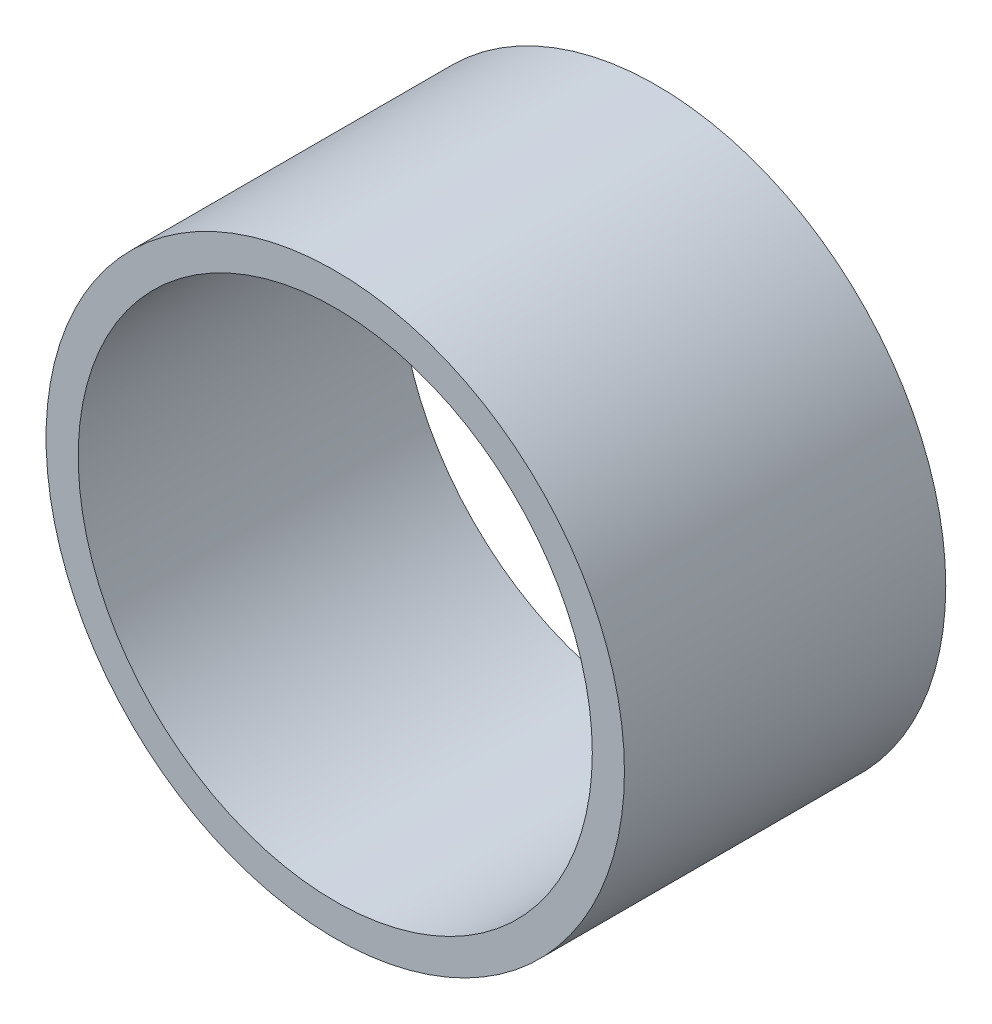
ISO-10303-21;
HEADER;
FILE_DESCRIPTION(('STEP AP214'),'2;1');
FILE_NAME('part.step','',(''),(''),'','','');
FILE_SCHEMA(('AUTOMOTIVE_DESIGN { 1 0 10303 214 1 1 1 1 }'));
ENDSEC;
DATA;
#1=APPLICATION_CONTEXT('core data for automotive mechanical design processes');
#2=APPLICATION_PROTOCOL_DEFINITION('international standard','automotive_design',2000,#1);
#3=PRODUCT_CONTEXT('',#1,'mechanical');
#4=PRODUCT('Part','Part','',(#3));
#5=PRODUCT_RELATED_PRODUCT_CATEGORY('part','',(#4));
#6=PRODUCT_DEFINITION_FORMATION('','',#4);
#7=PRODUCT_DEFINITION_CONTEXT('part definition',#1,'design');
#8=PRODUCT_DEFINITION('design','',#6,#7);
#9=PRODUCT_DEFINITION_SHAPE('','',#8);
#10=(LENGTH_UNIT() NAMED_UNIT(*) SI_UNIT(.MILLI.,.METRE.));
#11=(NAMED_UNIT(*) PLANE_ANGLE_UNIT() SI_UNIT($,.RADIAN.));
#12=(NAMED_UNIT(*) SI_UNIT($,.STERADIAN.) SOLID_ANGLE_UNIT());
#13=UNCERTAINTY_MEASURE_WITH_UNIT(LENGTH_MEASURE(1.E-05),#10,'distance_accuracy_value','');
#14=(GEOMETRIC_REPRESENTATION_CONTEXT(3) GLOBAL_UNCERTAINTY_ASSIGNED_CONTEXT((#13)) GLOBAL_UNIT_ASSIGNED_CONTEXT((#10,
#11,#12)) REPRESENTATION_CONTEXT('',''));
#15=CARTESIAN_POINT('',(0.,0.,0.));
#16=DIRECTION('',(0.,0.,1.));
#17=DIRECTION('',(1.,0.,0.));
#18=AXIS2_PLACEMENT_3D('',#15,#16,#17);
#19=CARTESIAN_POINT('',(0.,0.,5.));
#20=DIRECTION('',(0.,0.,1.));
#21=DIRECTION('',(1.,0.,0.));
#22=AXIS2_PLACEMENT_3D('',#19,#20,#21);
#23=PLANE('',#22);
#24=CARTESIAN_POINT('',(0.,0.,5.));
#25=DIRECTION('',(0.,0.,1.));
#26=DIRECTION('',(1.,0.,0.));
#27=AXIS2_PLACEMENT_3D('',#24,#25,#26);
#28=CIRCLE('',#27,4.5);
#29=CARTESIAN_POINT('',(4.5,0.,5.));
#30=VERTEX_POINT('',#29);
#31=EDGE_CURVE('E10',#30,#30,#28,.T.);
#32=ORIENTED_EDGE('',*,*,#31,.T.);
#33=EDGE_LOOP('',(#32));
#34=FACE_BOUND('',#33,.T.);
#35=CARTESIAN_POINT('',(0.,0.,5.));
#36=DIRECTION('',(0.,0.,1.));
#37=DIRECTION('',(1.,0.,0.));
#38=AXIS2_PLACEMENT_3D('',#35,#36,#37);
#39=CIRCLE('',#38,4.);
#40=CARTESIAN_POINT('',(4.,0.,5.));
#41=VERTEX_POINT('',#40);
#42=EDGE_CURVE('E52',#41,#41,#39,.T.);
#43=ORIENTED_EDGE('',*,*,#42,.F.);
#44=EDGE_LOOP('',(#43));
#45=FACE_BOUND('',#44,.T.);
#46=ADVANCED_FACE('F36',(#34,#45),#23,.T.);
#47=CARTESIAN_POINT('',(0.,0.,0.));
#48=DIRECTION('',(0.,0.,1.));
#49=DIRECTION('',(1.,0.,0.));
#50=AXIS2_PLACEMENT_3D('',#47,#48,#49);
#51=PLANE('',#50);
#52=CARTESIAN_POINT('',(0.,0.,0.));
#53=DIRECTION('',(0.,0.,1.));
#54=DIRECTION('',(1.,0.,0.));
#55=AXIS2_PLACEMENT_3D('',#52,#53,#54);
#56=CIRCLE('',#55,4.5);
#57=CARTESIAN_POINT('',(4.5,0.,0.));
#58=VERTEX_POINT('',#57);
#59=EDGE_CURVE('E40',#58,#58,#56,.T.);
#60=ORIENTED_EDGE('',*,*,#59,.F.);
#61=EDGE_LOOP('',(#60));
#62=FACE_BOUND('',#61,.T.);
#63=CARTESIAN_POINT('',(0.,0.,0.));
#64=DIRECTION('',(0.,0.,1.));
#65=DIRECTION('',(1.,0.,0.));
#66=AXIS2_PLACEMENT_3D('',#63,#64,#65);
#67=CIRCLE('',#66,4.);
#68=CARTESIAN_POINT('',(4.,0.,0.));
#69=VERTEX_POINT('',#68);
#70=EDGE_CURVE('E54',#69,#69,#67,.T.);
#71=ORIENTED_EDGE('',*,*,#70,.T.);
#72=EDGE_LOOP('',(#71));
#73=FACE_BOUND('',#72,.T.);
#74=ADVANCED_FACE('F65',(#62,#73),#51,.F.);
#75=CARTESIAN_POINT('',(0.,0.,5.));
#76=DIRECTION('',(0.,0.,-1.));
#77=DIRECTION('',(-1.,0.,0.));
#78=AXIS2_PLACEMENT_3D('',#75,#76,#77);
#79=CYLINDRICAL_SURFACE('',#78,4.5);
#80=ORIENTED_EDGE('',*,*,#31,.F.);
#81=EDGE_LOOP('',(#80));
#82=FACE_BOUND('',#81,.T.);
#83=ORIENTED_EDGE('',*,*,#59,.T.);
#84=EDGE_LOOP('',(#83));
#85=FACE_BOUND('',#84,.T.);
#86=ADVANCED_FACE('F38',(#82,#85),#79,.T.);
#87=CARTESIAN_POINT('',(0.,0.,5.));
#88=DIRECTION('',(0.,0.,-1.));
#89=DIRECTION('',(-1.,0.,0.));
#90=AXIS2_PLACEMENT_3D('',#87,#88,#89);
#91=CYLINDRICAL_SURFACE('',#90,4.);
#92=ORIENTED_EDGE('',*,*,#42,.T.);
#93=EDGE_LOOP('',(#92));
#94=FACE_BOUND('',#93,.T.);
#95=ORIENTED_EDGE('',*,*,#70,.F.);
#96=EDGE_LOOP('',(#95));
#97=FACE_BOUND('',#96,.T.);
#98=ADVANCED_FACE('F61',(#94,#97),#91,.F.);
#99=CLOSED_SHELL('',(#46,#74,#86,#98));
#100=MANIFOLD_SOLID_BREP('B2',#99);
#101=ADVANCED_BREP_SHAPE_REPRESENTATION('',(#18,#100),#14);
#102=SHAPE_DEFINITION_REPRESENTATION(#9,#101);
ENDSEC;
END-ISO-10303-21;
